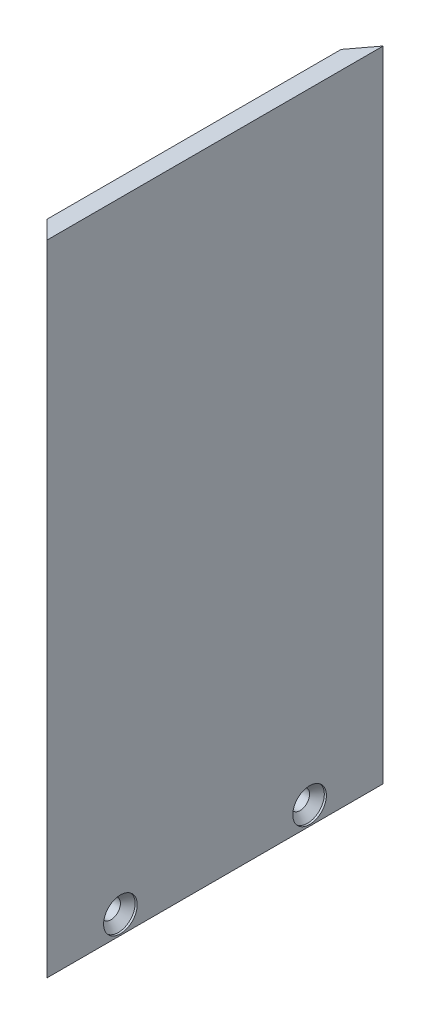
ISO-10303-21;
HEADER;
FILE_DESCRIPTION(('STEP AP214'),'2;1');
FILE_NAME('part.step','',(''),(''),'','','');
FILE_SCHEMA(('AUTOMOTIVE_DESIGN { 1 0 10303 214 1 1 1 1 }'));
ENDSEC;
DATA;
#1=APPLICATION_CONTEXT('core data for automotive mechanical design processes');
#2=APPLICATION_PROTOCOL_DEFINITION('international standard','automotive_design',2000,#1);
#3=PRODUCT_CONTEXT('',#1,'mechanical');
#4=PRODUCT('Part','Part','',(#3));
#5=PRODUCT_RELATED_PRODUCT_CATEGORY('part','',(#4));
#6=PRODUCT_DEFINITION_FORMATION('','',#4);
#7=PRODUCT_DEFINITION_CONTEXT('part definition',#1,'design');
#8=PRODUCT_DEFINITION('design','',#6,#7);
#9=PRODUCT_DEFINITION_SHAPE('','',#8);
#10=(LENGTH_UNIT() NAMED_UNIT(*) SI_UNIT(.MILLI.,.METRE.));
#11=(NAMED_UNIT(*) PLANE_ANGLE_UNIT() SI_UNIT($,.RADIAN.));
#12=(NAMED_UNIT(*) SI_UNIT($,.STERADIAN.) SOLID_ANGLE_UNIT());
#13=UNCERTAINTY_MEASURE_WITH_UNIT(LENGTH_MEASURE(1.E-05),#10,'distance_accuracy_value','');
#14=(GEOMETRIC_REPRESENTATION_CONTEXT(3) GLOBAL_UNCERTAINTY_ASSIGNED_CONTEXT((#13)) GLOBAL_UNIT_ASSIGNED_CONTEXT((#10,
#11,#12)) REPRESENTATION_CONTEXT('',''));
#15=CARTESIAN_POINT('',(0.,0.,0.));
#16=DIRECTION('',(0.,0.,1.));
#17=DIRECTION('',(1.,0.,0.));
#18=AXIS2_PLACEMENT_3D('',#15,#16,#17);
#19=CARTESIAN_POINT('',(0.,0.,0.));
#20=DIRECTION('',(1.,0.,0.));
#21=DIRECTION('',(0.,0.,1.));
#22=AXIS2_PLACEMENT_3D('',#19,#20,#21);
#23=PLANE('',#22);
#24=DIRECTION('',(0.,0.,1.));
#25=VECTOR('',#24,1.);
#26=CARTESIAN_POINT('',(0.,-153.405408347024,-80.));
#27=LINE('',#26,#25);
#28=CARTESIAN_POINT('',(0.,-153.405408347024,-69.9999999999999));
#29=VERTEX_POINT('',#28);
#30=CARTESIAN_POINT('',(0.,-153.405408347024,70.));
#31=VERTEX_POINT('',#30);
#32=EDGE_CURVE('E105',#29,#31,#27,.T.);
#33=ORIENTED_EDGE('',*,*,#32,.T.);
#34=DIRECTION('',(0.,-1.,0.));
#35=VECTOR('',#34,1.);
#36=CARTESIAN_POINT('',(0.,0.,70.));
#37=LINE('',#36,#35);
#38=CARTESIAN_POINT('',(0.,150.594591652976,70.));
#39=VERTEX_POINT('',#38);
#40=EDGE_CURVE('E48',#39,#31,#37,.T.);
#41=ORIENTED_EDGE('',*,*,#40,.F.);
#42=DIRECTION('',(0.,0.,1.));
#43=VECTOR('',#42,1.);
#44=CARTESIAN_POINT('',(0.,150.594591652976,-80.0000000000001));
#45=LINE('',#44,#43);
#46=CARTESIAN_POINT('',(0.,150.594591652976,-69.9999999999999));
#47=VERTEX_POINT('',#46);
#48=EDGE_CURVE('E109',#47,#39,#45,.T.);
#49=ORIENTED_EDGE('',*,*,#48,.F.);
#50=DIRECTION('',(0.,1.,0.));
#51=VECTOR('',#50,1.);
#52=CARTESIAN_POINT('',(0.,0.,-69.9999999999999));
#53=LINE('',#52,#51);
#54=EDGE_CURVE('E56',#29,#47,#53,.T.);
#55=ORIENTED_EDGE('',*,*,#54,.F.);
#56=EDGE_LOOP('',(#33,#41,#49,#55));
#57=FACE_BOUND('',#56,.T.);
#58=CARTESIAN_POINT('',(0.,-143.263507675127,45.0000000000013));
#59=DIRECTION('',(-1.,0.,0.));
#60=DIRECTION('',(0.,0.,1.));
#61=AXIS2_PLACEMENT_3D('',#58,#59,#60);
#62=CIRCLE('',#61,4.5);
#63=CARTESIAN_POINT('',(0.,-143.263507675127,49.5000000000013));
#64=VERTEX_POINT('',#63);
#65=EDGE_CURVE('E103',#64,#64,#62,.T.);
#66=ORIENTED_EDGE('',*,*,#65,.F.);
#67=EDGE_LOOP('',(#66));
#68=FACE_BOUND('',#67,.T.);
#69=CARTESIAN_POINT('',(0.,-143.263507675127,-44.9999999999987));
#70=DIRECTION('',(-1.,0.,0.));
#71=DIRECTION('',(0.,0.,1.));
#72=AXIS2_PLACEMENT_3D('',#69,#70,#71);
#73=CIRCLE('',#72,4.5);
#74=CARTESIAN_POINT('',(0.,-143.263507675127,-40.4999999999987));
#75=VERTEX_POINT('',#74);
#76=EDGE_CURVE('E36',#75,#75,#73,.T.);
#77=ORIENTED_EDGE('',*,*,#76,.F.);
#78=EDGE_LOOP('',(#77));
#79=FACE_BOUND('',#78,.T.);
#80=ADVANCED_FACE('F32',(#57,#68,#79),#23,.F.);
#81=CARTESIAN_POINT('',(10.,0.,0.));
#82=DIRECTION('',(1.,0.,0.));
#83=DIRECTION('',(0.,0.,1.));
#84=AXIS2_PLACEMENT_3D('',#81,#82,#83);
#85=PLANE('',#84);
#86=DIRECTION('',(0.,0.,-1.));
#87=VECTOR('',#86,1.);
#88=CARTESIAN_POINT('',(10.,152.,-80.));
#89=LINE('',#88,#87);
#90=CARTESIAN_POINT('',(10.,152.,80.));
#91=VERTEX_POINT('',#90);
#92=CARTESIAN_POINT('',(10.,152.,-80.0000000000001));
#93=VERTEX_POINT('',#92);
#94=EDGE_CURVE('E86',#91,#93,#89,.T.);
#95=ORIENTED_EDGE('',*,*,#94,.F.);
#96=DIRECTION('',(0.,1.,0.));
#97=VECTOR('',#96,1.);
#98=CARTESIAN_POINT('',(10.,152.,80.));
#99=LINE('',#98,#97);
#100=CARTESIAN_POINT('',(10.,-152.,80.));
#101=VERTEX_POINT('',#100);
#102=EDGE_CURVE('E90',#101,#91,#99,.T.);
#103=ORIENTED_EDGE('',*,*,#102,.F.);
#104=DIRECTION('',(0.,0.,1.));
#105=VECTOR('',#104,1.);
#106=CARTESIAN_POINT('',(10.,-152.,-80.));
#107=LINE('',#106,#105);
#108=CARTESIAN_POINT('',(10.,-152.,-80.));
#109=VERTEX_POINT('',#108);
#110=EDGE_CURVE('E82',#109,#101,#107,.T.);
#111=ORIENTED_EDGE('',*,*,#110,.F.);
#112=DIRECTION('',(0.,-1.,0.));
#113=VECTOR('',#112,1.);
#114=CARTESIAN_POINT('',(10.,152.,-80.));
#115=LINE('',#114,#113);
#116=EDGE_CURVE('E77',#93,#109,#115,.T.);
#117=ORIENTED_EDGE('',*,*,#116,.F.);
#118=EDGE_LOOP('',(#95,#103,#111,#117));
#119=FACE_BOUND('',#118,.T.);
#120=CARTESIAN_POINT('',(10.,-143.263507675127,-44.9999999999987));
#121=DIRECTION('',(-1.,0.,0.));
#122=DIRECTION('',(0.,0.,1.));
#123=AXIS2_PLACEMENT_3D('',#120,#121,#122);
#124=CIRCLE('',#123,8.00000000000001);
#125=CARTESIAN_POINT('',(10.,-143.263507675127,-36.9999999999987));
#126=VERTEX_POINT('',#125);
#127=EDGE_CURVE('E140',#126,#126,#124,.T.);
#128=ORIENTED_EDGE('',*,*,#127,.T.);
#129=EDGE_LOOP('',(#128));
#130=FACE_BOUND('',#129,.T.);
#131=CARTESIAN_POINT('',(10.,-143.263507675127,45.0000000000013));
#132=DIRECTION('',(-1.,0.,0.));
#133=DIRECTION('',(0.,0.,1.));
#134=AXIS2_PLACEMENT_3D('',#131,#132,#133);
#135=CIRCLE('',#134,8.00000000000001);
#136=CARTESIAN_POINT('',(10.,-143.263507675127,53.0000000000013));
#137=VERTEX_POINT('',#136);
#138=EDGE_CURVE('E117',#137,#137,#135,.T.);
#139=ORIENTED_EDGE('',*,*,#138,.T.);
#140=EDGE_LOOP('',(#139));
#141=FACE_BOUND('',#140,.T.);
#142=ADVANCED_FACE('F93',(#119,#130,#141),#85,.T.);
#143=CARTESIAN_POINT('',(10.,152.,-80.0000000000001));
#144=DIRECTION('',(0.139173100960059,-0.990268068741571,0.));
#145=DIRECTION('',(0.990268068741571,0.139173100960059,0.));
#146=AXIS2_PLACEMENT_3D('',#143,#144,#145);
#147=PLANE('',#146);
#148=ORIENTED_EDGE('',*,*,#94,.T.);
#149=DIRECTION('',(-0.703640787534025,-0.0988902636106754,0.703640787534029));
#150=VECTOR('',#149,1.);
#151=CARTESIAN_POINT('',(10.,152.,-80.));
#152=LINE('',#151,#150);
#153=EDGE_CURVE('E74',#47,#93,#152,.F.);
#154=ORIENTED_EDGE('',*,*,#153,.F.);
#155=ORIENTED_EDGE('',*,*,#48,.T.);
#156=DIRECTION('',(0.703640787534025,0.0988902636106756,0.703640787534029));
#157=VECTOR('',#156,1.);
#158=CARTESIAN_POINT('',(9.99999999999998,152.,80.));
#159=LINE('',#158,#157);
#160=EDGE_CURVE('E81',#91,#39,#159,.F.);
#161=ORIENTED_EDGE('',*,*,#160,.F.);
#162=EDGE_LOOP('',(#148,#154,#155,#161));
#163=FACE_BOUND('',#162,.T.);
#164=ADVANCED_FACE('F87',(#163),#147,.F.);
#165=CARTESIAN_POINT('',(10.,-152.,-80.));
#166=DIRECTION('',(0.139173100960062,-0.990268068741571,0.));
#167=DIRECTION('',(0.990268068741571,0.139173100960062,0.));
#168=AXIS2_PLACEMENT_3D('',#165,#166,#167);
#169=PLANE('',#168);
#170=ORIENTED_EDGE('',*,*,#32,.F.);
#171=DIRECTION('',(0.703640787534025,0.0988902636106773,-0.703640787534029));
#172=VECTOR('',#171,1.);
#173=CARTESIAN_POINT('',(10.,-152.,-80.));
#174=LINE('',#173,#172);
#175=EDGE_CURVE('E41',#109,#29,#174,.F.);
#176=ORIENTED_EDGE('',*,*,#175,.F.);
#177=ORIENTED_EDGE('',*,*,#110,.T.);
#178=DIRECTION('',(-0.703640787534025,-0.0988902636106775,-0.703640787534029));
#179=VECTOR('',#178,1.);
#180=CARTESIAN_POINT('',(-69.2176572610409,-163.133315674634,0.782342738958719));
#181=LINE('',#180,#179);
#182=EDGE_CURVE('E11',#31,#101,#181,.F.);
#183=ORIENTED_EDGE('',*,*,#182,.F.);
#184=EDGE_LOOP('',(#170,#176,#177,#183));
#185=FACE_BOUND('',#184,.T.);
#186=ADVANCED_FACE('F124',(#185),#169,.T.);
#187=CARTESIAN_POINT('',(9.99999999999998,152.,80.));
#188=DIRECTION('',(0.707106781186549,0.,-0.707106781186545));
#189=DIRECTION('',(0.,1.,0.));
#190=AXIS2_PLACEMENT_3D('',#187,#188,#189);
#191=PLANE('',#190);
#192=ORIENTED_EDGE('',*,*,#40,.T.);
#193=ORIENTED_EDGE('',*,*,#182,.T.);
#194=ORIENTED_EDGE('',*,*,#102,.T.);
#195=ORIENTED_EDGE('',*,*,#160,.T.);
#196=EDGE_LOOP('',(#192,#193,#194,#195));
#197=FACE_BOUND('',#196,.T.);
#198=ADVANCED_FACE('F121',(#197),#191,.F.);
#199=CARTESIAN_POINT('',(10.,152.,-80.));
#200=DIRECTION('',(0.70710678118655,0.,0.707106781186545));
#201=DIRECTION('',(0.,-1.,0.));
#202=AXIS2_PLACEMENT_3D('',#199,#200,#201);
#203=PLANE('',#202);
#204=ORIENTED_EDGE('',*,*,#175,.T.);
#205=ORIENTED_EDGE('',*,*,#54,.T.);
#206=ORIENTED_EDGE('',*,*,#153,.T.);
#207=ORIENTED_EDGE('',*,*,#116,.T.);
#208=EDGE_LOOP('',(#204,#205,#206,#207));
#209=FACE_BOUND('',#208,.T.);
#210=ADVANCED_FACE('F34',(#209),#203,.F.);
#211=CARTESIAN_POINT('',(10.,-143.263507675127,45.0000000000013));
#212=DIRECTION('',(1.,0.,0.));
#213=DIRECTION('',(0.,0.,1.));
#214=AXIS2_PLACEMENT_3D('',#211,#212,#213);
#215=CYLINDRICAL_SURFACE('',#214,4.5);
#216=CARTESIAN_POINT('',(5.5,-143.263507675127,45.0000000000013));
#217=DIRECTION('',(-1.,0.,0.));
#218=DIRECTION('',(0.,0.,1.));
#219=AXIS2_PLACEMENT_3D('',#216,#217,#218);
#220=CIRCLE('',#219,4.5);
#221=CARTESIAN_POINT('',(5.5,-143.263507675127,49.5000000000013));
#222=VERTEX_POINT('',#221);
#223=EDGE_CURVE('E106',#222,#222,#220,.T.);
#224=ORIENTED_EDGE('',*,*,#223,.F.);
#225=EDGE_LOOP('',(#224));
#226=FACE_BOUND('',#225,.T.);
#227=ORIENTED_EDGE('',*,*,#65,.T.);
#228=EDGE_LOOP('',(#227));
#229=FACE_BOUND('',#228,.T.);
#230=ADVANCED_FACE('F168',(#226,#229),#215,.F.);
#231=CARTESIAN_POINT('',(9.,-143.263507675127,45.0000000000013));
#232=DIRECTION('',(1.,0.,0.));
#233=DIRECTION('',(0.,0.,1.));
#234=AXIS2_PLACEMENT_3D('',#231,#232,#233);
#235=CONICAL_SURFACE('',#234,8.00000000000001,0.785398163397449);
#236=ORIENTED_EDGE('',*,*,#223,.T.);
#237=EDGE_LOOP('',(#236));
#238=FACE_BOUND('',#237,.T.);
#239=CARTESIAN_POINT('',(9.,-143.263507675127,45.0000000000013));
#240=DIRECTION('',(-1.,0.,0.));
#241=DIRECTION('',(0.,0.,1.));
#242=AXIS2_PLACEMENT_3D('',#239,#240,#241);
#243=CIRCLE('',#242,8.00000000000001);
#244=CARTESIAN_POINT('',(9.,-143.263507675127,53.0000000000013));
#245=VERTEX_POINT('',#244);
#246=EDGE_CURVE('E112',#245,#245,#243,.T.);
#247=ORIENTED_EDGE('',*,*,#246,.F.);
#248=EDGE_LOOP('',(#247));
#249=FACE_BOUND('',#248,.T.);
#250=ADVANCED_FACE('F164',(#238,#249),#235,.F.);
#251=CARTESIAN_POINT('',(10.,-143.263507675127,45.0000000000013));
#252=DIRECTION('',(1.,0.,0.));
#253=DIRECTION('',(0.,0.,1.));
#254=AXIS2_PLACEMENT_3D('',#251,#252,#253);
#255=CYLINDRICAL_SURFACE('',#254,8.00000000000001);
#256=ORIENTED_EDGE('',*,*,#246,.T.);
#257=EDGE_LOOP('',(#256));
#258=FACE_BOUND('',#257,.T.);
#259=ORIENTED_EDGE('',*,*,#138,.F.);
#260=EDGE_LOOP('',(#259));
#261=FACE_BOUND('',#260,.T.);
#262=ADVANCED_FACE('F160',(#258,#261),#255,.F.);
#263=CARTESIAN_POINT('',(10.,-143.263507675127,-44.9999999999987));
#264=DIRECTION('',(1.,0.,0.));
#265=DIRECTION('',(0.,0.,1.));
#266=AXIS2_PLACEMENT_3D('',#263,#264,#265);
#267=CYLINDRICAL_SURFACE('',#266,4.5);
#268=CARTESIAN_POINT('',(5.5,-143.263507675127,-44.9999999999987));
#269=DIRECTION('',(-1.,0.,0.));
#270=DIRECTION('',(0.,0.,1.));
#271=AXIS2_PLACEMENT_3D('',#268,#269,#270);
#272=CIRCLE('',#271,4.5);
#273=CARTESIAN_POINT('',(5.5,-143.263507675127,-40.4999999999987));
#274=VERTEX_POINT('',#273);
#275=EDGE_CURVE('E132',#274,#274,#272,.T.);
#276=ORIENTED_EDGE('',*,*,#275,.F.);
#277=EDGE_LOOP('',(#276));
#278=FACE_BOUND('',#277,.T.);
#279=ORIENTED_EDGE('',*,*,#76,.T.);
#280=EDGE_LOOP('',(#279));
#281=FACE_BOUND('',#280,.T.);
#282=ADVANCED_FACE('F155',(#278,#281),#267,.F.);
#283=CARTESIAN_POINT('',(9.,-143.263507675127,-44.9999999999987));
#284=DIRECTION('',(1.,0.,0.));
#285=DIRECTION('',(0.,0.,1.));
#286=AXIS2_PLACEMENT_3D('',#283,#284,#285);
#287=CONICAL_SURFACE('',#286,8.00000000000001,0.785398163397449);
#288=ORIENTED_EDGE('',*,*,#275,.T.);
#289=EDGE_LOOP('',(#288));
#290=FACE_BOUND('',#289,.T.);
#291=CARTESIAN_POINT('',(9.,-143.263507675127,-44.9999999999987));
#292=DIRECTION('',(-1.,0.,0.));
#293=DIRECTION('',(0.,0.,1.));
#294=AXIS2_PLACEMENT_3D('',#291,#292,#293);
#295=CIRCLE('',#294,8.00000000000001);
#296=CARTESIAN_POINT('',(9.,-143.263507675127,-36.9999999999987));
#297=VERTEX_POINT('',#296);
#298=EDGE_CURVE('E135',#297,#297,#295,.T.);
#299=ORIENTED_EDGE('',*,*,#298,.F.);
#300=EDGE_LOOP('',(#299));
#301=FACE_BOUND('',#300,.T.);
#302=ADVANCED_FACE('F149',(#290,#301),#287,.F.);
#303=CARTESIAN_POINT('',(10.,-143.263507675127,-44.9999999999987));
#304=DIRECTION('',(1.,0.,0.));
#305=DIRECTION('',(0.,0.,1.));
#306=AXIS2_PLACEMENT_3D('',#303,#304,#305);
#307=CYLINDRICAL_SURFACE('',#306,8.00000000000001);
#308=ORIENTED_EDGE('',*,*,#298,.T.);
#309=EDGE_LOOP('',(#308));
#310=FACE_BOUND('',#309,.T.);
#311=ORIENTED_EDGE('',*,*,#127,.F.);
#312=EDGE_LOOP('',(#311));
#313=FACE_BOUND('',#312,.T.);
#314=ADVANCED_FACE('F147',(#310,#313),#307,.F.);
#315=CLOSED_SHELL('',(#80,#142,#164,#186,#198,#210,#230,#250,#262,#282,#302,#314));
#316=MANIFOLD_SOLID_BREP('B2',#315);
#317=ADVANCED_BREP_SHAPE_REPRESENTATION('',(#18,#316),#14);
#318=SHAPE_DEFINITION_REPRESENTATION(#9,#317);
ENDSEC;
END-ISO-10303-21;
